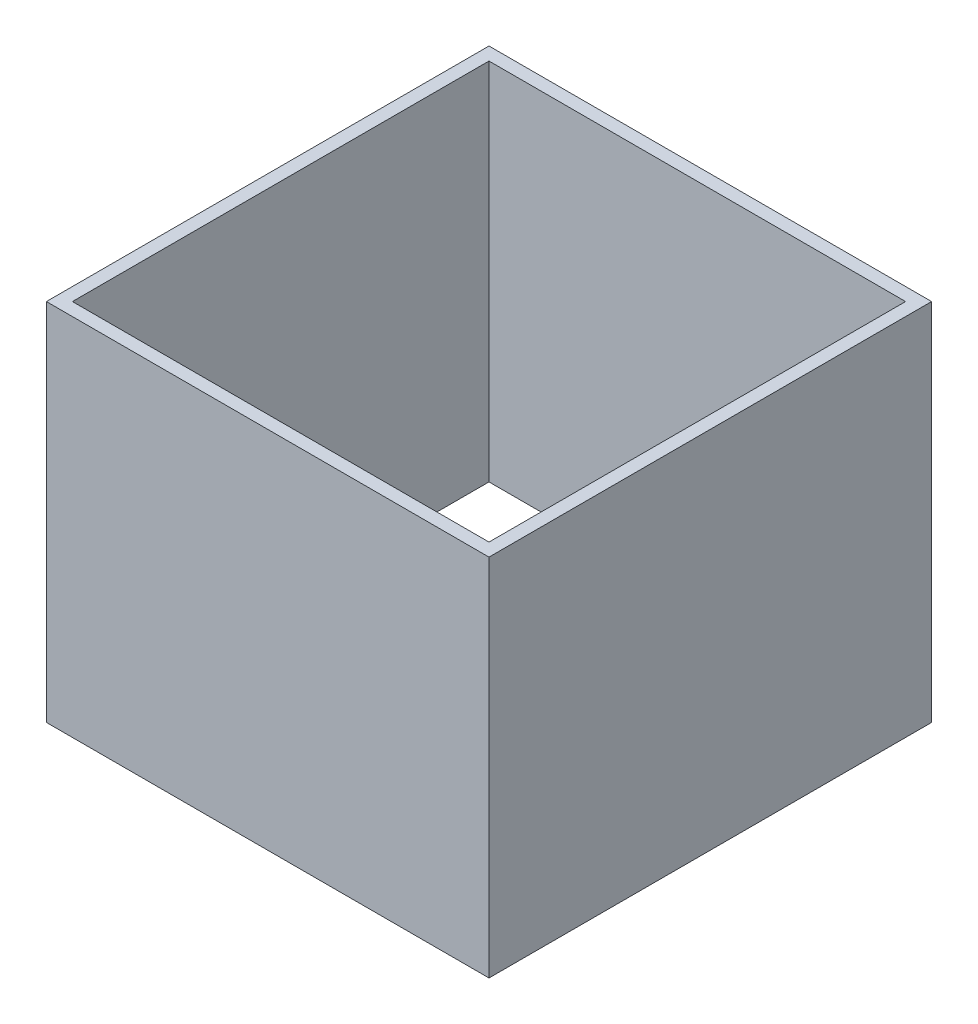
ISO-10303-21;
HEADER;
FILE_DESCRIPTION(('STEP AP214'),'2;1');
FILE_NAME('part.step','',(''),(''),'','','');
FILE_SCHEMA(('AUTOMOTIVE_DESIGN { 1 0 10303 214 1 1 1 1 }'));
ENDSEC;
DATA;
#1=APPLICATION_CONTEXT('core data for automotive mechanical design processes');
#2=APPLICATION_PROTOCOL_DEFINITION('international standard','automotive_design',2000,#1);
#3=PRODUCT_CONTEXT('',#1,'mechanical');
#4=PRODUCT('Part','Part','',(#3));
#5=PRODUCT_RELATED_PRODUCT_CATEGORY('part','',(#4));
#6=PRODUCT_DEFINITION_FORMATION('','',#4);
#7=PRODUCT_DEFINITION_CONTEXT('part definition',#1,'design');
#8=PRODUCT_DEFINITION('design','',#6,#7);
#9=PRODUCT_DEFINITION_SHAPE('','',#8);
#10=(LENGTH_UNIT() NAMED_UNIT(*) SI_UNIT(.MILLI.,.METRE.));
#11=(NAMED_UNIT(*) PLANE_ANGLE_UNIT() SI_UNIT($,.RADIAN.));
#12=(NAMED_UNIT(*) SI_UNIT($,.STERADIAN.) SOLID_ANGLE_UNIT());
#13=UNCERTAINTY_MEASURE_WITH_UNIT(LENGTH_MEASURE(1.E-05),#10,'distance_accuracy_value','');
#14=(GEOMETRIC_REPRESENTATION_CONTEXT(3) GLOBAL_UNCERTAINTY_ASSIGNED_CONTEXT((#13)) GLOBAL_UNIT_ASSIGNED_CONTEXT((#10,
#11,#12)) REPRESENTATION_CONTEXT('',''));
#15=CARTESIAN_POINT('',(0.,0.,0.));
#16=DIRECTION('',(0.,0.,1.));
#17=DIRECTION('',(1.,0.,0.));
#18=AXIS2_PLACEMENT_3D('',#15,#16,#17);
#19=CARTESIAN_POINT('',(0.,177.8,0.));
#20=DIRECTION('',(0.,1.,0.));
#21=DIRECTION('',(0.,0.,1.));
#22=AXIS2_PLACEMENT_3D('',#19,#20,#21);
#23=PLANE('',#22);
#24=DIRECTION('',(0.,0.,-1.));
#25=VECTOR('',#24,1.);
#26=CARTESIAN_POINT('',(107.95,177.8,0.));
#27=LINE('',#26,#25);
#28=CARTESIAN_POINT('',(107.95,177.8,107.95));
#29=VERTEX_POINT('',#28);
#30=CARTESIAN_POINT('',(107.95,177.8,-107.95));
#31=VERTEX_POINT('',#30);
#32=EDGE_CURVE('E157',#29,#31,#27,.T.);
#33=ORIENTED_EDGE('',*,*,#32,.T.);
#34=DIRECTION('',(-1.,0.,0.));
#35=VECTOR('',#34,1.);
#36=CARTESIAN_POINT('',(0.,177.8,-107.95));
#37=LINE('',#36,#35);
#38=CARTESIAN_POINT('',(-107.95,177.8,-107.95));
#39=VERTEX_POINT('',#38);
#40=EDGE_CURVE('E160',#31,#39,#37,.T.);
#41=ORIENTED_EDGE('',*,*,#40,.T.);
#42=DIRECTION('',(0.,0.,1.));
#43=VECTOR('',#42,1.);
#44=CARTESIAN_POINT('',(-107.95,177.8,0.));
#45=LINE('',#44,#43);
#46=CARTESIAN_POINT('',(-107.95,177.8,107.95));
#47=VERTEX_POINT('',#46);
#48=EDGE_CURVE('E163',#39,#47,#45,.T.);
#49=ORIENTED_EDGE('',*,*,#48,.T.);
#50=DIRECTION('',(1.,0.,0.));
#51=VECTOR('',#50,1.);
#52=CARTESIAN_POINT('',(0.,177.8,107.95));
#53=LINE('',#52,#51);
#54=EDGE_CURVE('E165',#47,#29,#53,.T.);
#55=ORIENTED_EDGE('',*,*,#54,.T.);
#56=EDGE_LOOP('',(#33,#41,#49,#55));
#57=FACE_BOUND('',#56,.T.);
#58=DIRECTION('',(-1.,0.,0.));
#59=VECTOR('',#58,1.);
#60=CARTESIAN_POINT('',(-101.6,177.8,-101.6));
#61=LINE('',#60,#59);
#62=CARTESIAN_POINT('',(101.6,177.8,-101.6));
#63=VERTEX_POINT('',#62);
#64=CARTESIAN_POINT('',(-101.6,177.8,-101.6));
#65=VERTEX_POINT('',#64);
#66=EDGE_CURVE('E129',#63,#65,#61,.T.);
#67=ORIENTED_EDGE('',*,*,#66,.F.);
#68=DIRECTION('',(0.,0.,-1.));
#69=VECTOR('',#68,1.);
#70=CARTESIAN_POINT('',(101.6,177.8,101.6));
#71=LINE('',#70,#69);
#72=CARTESIAN_POINT('',(101.6,177.8,101.6));
#73=VERTEX_POINT('',#72);
#74=EDGE_CURVE('E121',#73,#63,#71,.T.);
#75=ORIENTED_EDGE('',*,*,#74,.F.);
#76=DIRECTION('',(1.,0.,0.));
#77=VECTOR('',#76,1.);
#78=CARTESIAN_POINT('',(-101.6,177.8,101.6));
#79=LINE('',#78,#77);
#80=CARTESIAN_POINT('',(-101.6,177.8,101.6));
#81=VERTEX_POINT('',#80);
#82=EDGE_CURVE('E143',#81,#73,#79,.T.);
#83=ORIENTED_EDGE('',*,*,#82,.F.);
#84=DIRECTION('',(0.,0.,1.));
#85=VECTOR('',#84,1.);
#86=CARTESIAN_POINT('',(-101.6,177.8,101.6));
#87=LINE('',#86,#85);
#88=EDGE_CURVE('E141',#65,#81,#87,.T.);
#89=ORIENTED_EDGE('',*,*,#88,.F.);
#90=EDGE_LOOP('',(#67,#75,#83,#89));
#91=FACE_BOUND('',#90,.T.);
#92=ADVANCED_FACE('F56',(#57,#91),#23,.T.);
#93=CARTESIAN_POINT('',(0.,0.,0.));
#94=DIRECTION('',(0.,1.,0.));
#95=DIRECTION('',(0.,0.,1.));
#96=AXIS2_PLACEMENT_3D('',#93,#94,#95);
#97=PLANE('',#96);
#98=DIRECTION('',(0.,0.,-1.));
#99=VECTOR('',#98,1.);
#100=CARTESIAN_POINT('',(107.95,0.,0.));
#101=LINE('',#100,#99);
#102=CARTESIAN_POINT('',(107.95,0.,107.95));
#103=VERTEX_POINT('',#102);
#104=CARTESIAN_POINT('',(107.95,0.,-107.95));
#105=VERTEX_POINT('',#104);
#106=EDGE_CURVE('E137',#103,#105,#101,.T.);
#107=ORIENTED_EDGE('',*,*,#106,.F.);
#108=DIRECTION('',(1.,0.,0.));
#109=VECTOR('',#108,1.);
#110=CARTESIAN_POINT('',(0.,0.,107.95));
#111=LINE('',#110,#109);
#112=CARTESIAN_POINT('',(-107.95,0.,107.95));
#113=VERTEX_POINT('',#112);
#114=EDGE_CURVE('E161',#113,#103,#111,.T.);
#115=ORIENTED_EDGE('',*,*,#114,.F.);
#116=DIRECTION('',(0.,0.,1.));
#117=VECTOR('',#116,1.);
#118=CARTESIAN_POINT('',(-107.95,0.,0.));
#119=LINE('',#118,#117);
#120=CARTESIAN_POINT('',(-107.95,0.,-107.95));
#121=VERTEX_POINT('',#120);
#122=EDGE_CURVE('E172',#121,#113,#119,.T.);
#123=ORIENTED_EDGE('',*,*,#122,.F.);
#124=DIRECTION('',(-1.,0.,0.));
#125=VECTOR('',#124,1.);
#126=CARTESIAN_POINT('',(0.,0.,-107.95));
#127=LINE('',#126,#125);
#128=EDGE_CURVE('E170',#105,#121,#127,.T.);
#129=ORIENTED_EDGE('',*,*,#128,.F.);
#130=EDGE_LOOP('',(#107,#115,#123,#129));
#131=FACE_BOUND('',#130,.T.);
#132=DIRECTION('',(0.,0.,-1.));
#133=VECTOR('',#132,1.);
#134=CARTESIAN_POINT('',(101.6,0.,101.6));
#135=LINE('',#134,#133);
#136=CARTESIAN_POINT('',(101.6,0.,101.6));
#137=VERTEX_POINT('',#136);
#138=CARTESIAN_POINT('',(101.6,0.,-101.6));
#139=VERTEX_POINT('',#138);
#140=EDGE_CURVE('E79',#137,#139,#135,.T.);
#141=ORIENTED_EDGE('',*,*,#140,.T.);
#142=DIRECTION('',(-1.,0.,0.));
#143=VECTOR('',#142,1.);
#144=CARTESIAN_POINT('',(-101.6,0.,-101.6));
#145=LINE('',#144,#143);
#146=CARTESIAN_POINT('',(-101.6,0.,-101.6));
#147=VERTEX_POINT('',#146);
#148=EDGE_CURVE('E136',#139,#147,#145,.T.);
#149=ORIENTED_EDGE('',*,*,#148,.T.);
#150=DIRECTION('',(0.,0.,1.));
#151=VECTOR('',#150,1.);
#152=CARTESIAN_POINT('',(-101.6,0.,101.6));
#153=LINE('',#152,#151);
#154=CARTESIAN_POINT('',(-101.6,0.,101.6));
#155=VERTEX_POINT('',#154);
#156=EDGE_CURVE('E149',#147,#155,#153,.T.);
#157=ORIENTED_EDGE('',*,*,#156,.T.);
#158=DIRECTION('',(1.,0.,0.));
#159=VECTOR('',#158,1.);
#160=CARTESIAN_POINT('',(-101.6,0.,101.6));
#161=LINE('',#160,#159);
#162=EDGE_CURVE('E130',#155,#137,#161,.T.);
#163=ORIENTED_EDGE('',*,*,#162,.T.);
#164=EDGE_LOOP('',(#141,#149,#157,#163));
#165=FACE_BOUND('',#164,.T.);
#166=ADVANCED_FACE('F190',(#131,#165),#97,.F.);
#167=CARTESIAN_POINT('',(107.95,177.8,0.));
#168=DIRECTION('',(-1.,0.,0.));
#169=DIRECTION('',(0.,0.,1.));
#170=AXIS2_PLACEMENT_3D('',#167,#168,#169);
#171=PLANE('',#170);
#172=ORIENTED_EDGE('',*,*,#106,.T.);
#173=DIRECTION('',(0.,-1.,0.));
#174=VECTOR('',#173,1.);
#175=CARTESIAN_POINT('',(107.95,177.8,-107.95));
#176=LINE('',#175,#174);
#177=EDGE_CURVE('E12',#31,#105,#176,.T.);
#178=ORIENTED_EDGE('',*,*,#177,.F.);
#179=ORIENTED_EDGE('',*,*,#32,.F.);
#180=DIRECTION('',(0.,-1.,0.));
#181=VECTOR('',#180,1.);
#182=CARTESIAN_POINT('',(107.95,177.8,107.95));
#183=LINE('',#182,#181);
#184=EDGE_CURVE('E167',#29,#103,#183,.T.);
#185=ORIENTED_EDGE('',*,*,#184,.T.);
#186=EDGE_LOOP('',(#172,#178,#179,#185));
#187=FACE_BOUND('',#186,.T.);
#188=ADVANCED_FACE('F58',(#187),#171,.F.);
#189=CARTESIAN_POINT('',(0.,177.8,-107.95));
#190=DIRECTION('',(0.,0.,1.));
#191=DIRECTION('',(1.,0.,0.));
#192=AXIS2_PLACEMENT_3D('',#189,#190,#191);
#193=PLANE('',#192);
#194=ORIENTED_EDGE('',*,*,#128,.T.);
#195=DIRECTION('',(0.,-1.,0.));
#196=VECTOR('',#195,1.);
#197=CARTESIAN_POINT('',(-107.95,177.8,-107.95));
#198=LINE('',#197,#196);
#199=EDGE_CURVE('E64',#39,#121,#198,.T.);
#200=ORIENTED_EDGE('',*,*,#199,.F.);
#201=ORIENTED_EDGE('',*,*,#40,.F.);
#202=ORIENTED_EDGE('',*,*,#177,.T.);
#203=EDGE_LOOP('',(#194,#200,#201,#202));
#204=FACE_BOUND('',#203,.T.);
#205=ADVANCED_FACE('F200',(#204),#193,.F.);
#206=CARTESIAN_POINT('',(-107.95,177.8,0.));
#207=DIRECTION('',(1.,0.,0.));
#208=DIRECTION('',(0.,0.,-1.));
#209=AXIS2_PLACEMENT_3D('',#206,#207,#208);
#210=PLANE('',#209);
#211=ORIENTED_EDGE('',*,*,#122,.T.);
#212=DIRECTION('',(0.,-1.,0.));
#213=VECTOR('',#212,1.);
#214=CARTESIAN_POINT('',(-107.95,177.8,107.95));
#215=LINE('',#214,#213);
#216=EDGE_CURVE('E177',#47,#113,#215,.T.);
#217=ORIENTED_EDGE('',*,*,#216,.F.);
#218=ORIENTED_EDGE('',*,*,#48,.F.);
#219=ORIENTED_EDGE('',*,*,#199,.T.);
#220=EDGE_LOOP('',(#211,#217,#218,#219));
#221=FACE_BOUND('',#220,.T.);
#222=ADVANCED_FACE('F184',(#221),#210,.F.);
#223=CARTESIAN_POINT('',(0.,177.8,107.95));
#224=DIRECTION('',(0.,0.,-1.));
#225=DIRECTION('',(-1.,0.,0.));
#226=AXIS2_PLACEMENT_3D('',#223,#224,#225);
#227=PLANE('',#226);
#228=ORIENTED_EDGE('',*,*,#114,.T.);
#229=ORIENTED_EDGE('',*,*,#184,.F.);
#230=ORIENTED_EDGE('',*,*,#54,.F.);
#231=ORIENTED_EDGE('',*,*,#216,.T.);
#232=EDGE_LOOP('',(#228,#229,#230,#231));
#233=FACE_BOUND('',#232,.T.);
#234=ADVANCED_FACE('F194',(#233),#227,.F.);
#235=CARTESIAN_POINT('',(101.6,177.8,101.6));
#236=DIRECTION('',(-1.,0.,0.));
#237=DIRECTION('',(0.,0.,1.));
#238=AXIS2_PLACEMENT_3D('',#235,#236,#237);
#239=PLANE('',#238);
#240=ORIENTED_EDGE('',*,*,#140,.F.);
#241=DIRECTION('',(0.,-1.,0.));
#242=VECTOR('',#241,1.);
#243=CARTESIAN_POINT('',(101.6,177.8,101.6));
#244=LINE('',#243,#242);
#245=EDGE_CURVE('E125',#73,#137,#244,.T.);
#246=ORIENTED_EDGE('',*,*,#245,.F.);
#247=ORIENTED_EDGE('',*,*,#74,.T.);
#248=DIRECTION('',(0.,-1.,0.));
#249=VECTOR('',#248,1.);
#250=CARTESIAN_POINT('',(101.6,177.8,-101.6));
#251=LINE('',#250,#249);
#252=EDGE_CURVE('E124',#63,#139,#251,.T.);
#253=ORIENTED_EDGE('',*,*,#252,.T.);
#254=EDGE_LOOP('',(#240,#246,#247,#253));
#255=FACE_BOUND('',#254,.T.);
#256=ADVANCED_FACE('F123',(#255),#239,.T.);
#257=CARTESIAN_POINT('',(-101.6,177.8,-101.6));
#258=DIRECTION('',(0.,0.,1.));
#259=DIRECTION('',(1.,0.,0.));
#260=AXIS2_PLACEMENT_3D('',#257,#258,#259);
#261=PLANE('',#260);
#262=ORIENTED_EDGE('',*,*,#148,.F.);
#263=ORIENTED_EDGE('',*,*,#252,.F.);
#264=ORIENTED_EDGE('',*,*,#66,.T.);
#265=DIRECTION('',(0.,-1.,0.));
#266=VECTOR('',#265,1.);
#267=CARTESIAN_POINT('',(-101.6,177.8,-101.6));
#268=LINE('',#267,#266);
#269=EDGE_CURVE('E138',#65,#147,#268,.T.);
#270=ORIENTED_EDGE('',*,*,#269,.T.);
#271=EDGE_LOOP('',(#262,#263,#264,#270));
#272=FACE_BOUND('',#271,.T.);
#273=ADVANCED_FACE('F133',(#272),#261,.T.);
#274=CARTESIAN_POINT('',(-101.6,177.8,101.6));
#275=DIRECTION('',(1.,0.,0.));
#276=DIRECTION('',(0.,0.,-1.));
#277=AXIS2_PLACEMENT_3D('',#274,#275,#276);
#278=PLANE('',#277);
#279=ORIENTED_EDGE('',*,*,#156,.F.);
#280=ORIENTED_EDGE('',*,*,#269,.F.);
#281=ORIENTED_EDGE('',*,*,#88,.T.);
#282=DIRECTION('',(0.,-1.,0.));
#283=VECTOR('',#282,1.);
#284=CARTESIAN_POINT('',(-101.6,177.8,101.6));
#285=LINE('',#284,#283);
#286=EDGE_CURVE('E71',#81,#155,#285,.T.);
#287=ORIENTED_EDGE('',*,*,#286,.T.);
#288=EDGE_LOOP('',(#279,#280,#281,#287));
#289=FACE_BOUND('',#288,.T.);
#290=ADVANCED_FACE('F223',(#289),#278,.T.);
#291=CARTESIAN_POINT('',(-101.6,177.8,101.6));
#292=DIRECTION('',(0.,0.,-1.));
#293=DIRECTION('',(-1.,0.,0.));
#294=AXIS2_PLACEMENT_3D('',#291,#292,#293);
#295=PLANE('',#294);
#296=ORIENTED_EDGE('',*,*,#162,.F.);
#297=ORIENTED_EDGE('',*,*,#286,.F.);
#298=ORIENTED_EDGE('',*,*,#82,.T.);
#299=ORIENTED_EDGE('',*,*,#245,.T.);
#300=EDGE_LOOP('',(#296,#297,#298,#299));
#301=FACE_BOUND('',#300,.T.);
#302=ADVANCED_FACE('F227',(#301),#295,.T.);
#303=CLOSED_SHELL('',(#92,#166,#188,#205,#222,#234,#256,#273,#290,#302));
#304=MANIFOLD_SOLID_BREP('B2',#303);
#305=ADVANCED_BREP_SHAPE_REPRESENTATION('',(#18,#304),#14);
#306=SHAPE_DEFINITION_REPRESENTATION(#9,#305);
ENDSEC;
END-ISO-10303-21;
